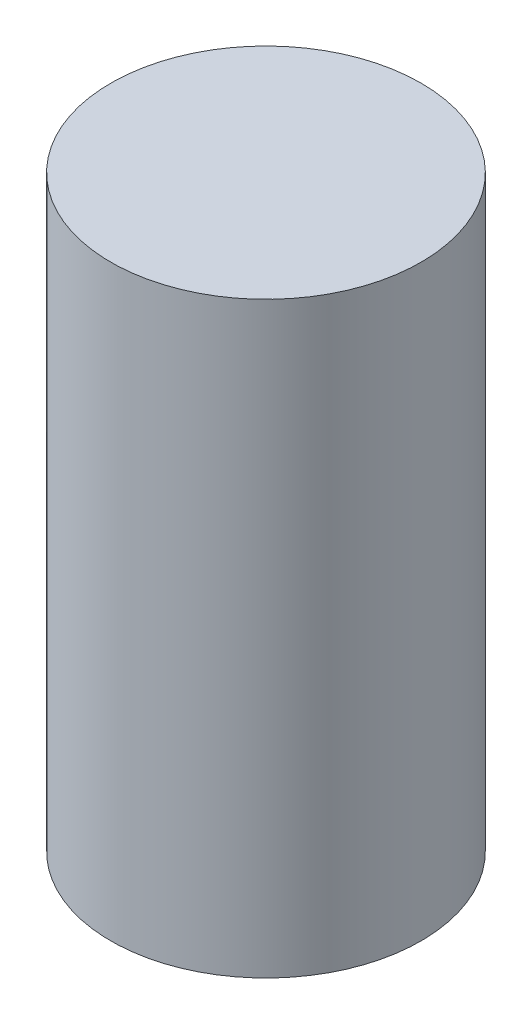
ISO-10303-21;
HEADER;
FILE_DESCRIPTION(('STEP AP214'),'2;1');
FILE_NAME('part.step','',(''),(''),'','','');
FILE_SCHEMA(('AUTOMOTIVE_DESIGN { 1 0 10303 214 1 1 1 1 }'));
ENDSEC;
DATA;
#1=APPLICATION_CONTEXT('core data for automotive mechanical design processes');
#2=APPLICATION_PROTOCOL_DEFINITION('international standard','automotive_design',2000,#1);
#3=PRODUCT_CONTEXT('',#1,'mechanical');
#4=PRODUCT('Part','Part','',(#3));
#5=PRODUCT_RELATED_PRODUCT_CATEGORY('part','',(#4));
#6=PRODUCT_DEFINITION_FORMATION('','',#4);
#7=PRODUCT_DEFINITION_CONTEXT('part definition',#1,'design');
#8=PRODUCT_DEFINITION('design','',#6,#7);
#9=PRODUCT_DEFINITION_SHAPE('','',#8);
#10=(LENGTH_UNIT() NAMED_UNIT(*) SI_UNIT(.MILLI.,.METRE.));
#11=(NAMED_UNIT(*) PLANE_ANGLE_UNIT() SI_UNIT($,.RADIAN.));
#12=(NAMED_UNIT(*) SI_UNIT($,.STERADIAN.) SOLID_ANGLE_UNIT());
#13=UNCERTAINTY_MEASURE_WITH_UNIT(LENGTH_MEASURE(1.E-05),#10,'distance_accuracy_value','');
#14=(GEOMETRIC_REPRESENTATION_CONTEXT(3) GLOBAL_UNCERTAINTY_ASSIGNED_CONTEXT((#13)) GLOBAL_UNIT_ASSIGNED_CONTEXT((#10,
#11,#12)) REPRESENTATION_CONTEXT('',''));
#15=CARTESIAN_POINT('',(0.,0.,0.));
#16=DIRECTION('',(0.,0.,1.));
#17=DIRECTION('',(1.,0.,0.));
#18=AXIS2_PLACEMENT_3D('',#15,#16,#17);
#19=CARTESIAN_POINT('',(0.,24.638,0.));
#20=DIRECTION('',(0.,-1.,0.));
#21=DIRECTION('',(0.,0.,-1.));
#22=AXIS2_PLACEMENT_3D('',#19,#20,#21);
#23=CYLINDRICAL_SURFACE('',#22,6.5024);
#24=CARTESIAN_POINT('',(0.,24.638,0.));
#25=DIRECTION('',(0.,1.,0.));
#26=DIRECTION('',(0.,0.,1.));
#27=AXIS2_PLACEMENT_3D('',#24,#25,#26);
#28=CIRCLE('',#27,6.5024);
#29=CARTESIAN_POINT('',(0.,24.638,-6.5024));
#30=VERTEX_POINT('',#29);
#31=EDGE_CURVE('E10',#30,#30,#28,.T.);
#32=CARTESIAN_POINT('',(0.,0.,0.));
#33=DIRECTION('',(0.,1.,0.));
#34=DIRECTION('',(0.,0.,1.));
#35=AXIS2_PLACEMENT_3D('',#32,#33,#34);
#36=CIRCLE('',#35,6.5024);
#37=CARTESIAN_POINT('',(0.,0.,-6.5024));
#38=VERTEX_POINT('',#37);
#39=EDGE_CURVE('E34',#38,#38,#36,.T.);
#40=CARTESIAN_POINT('',(0.,24.638,-6.5024));
#41=CARTESIAN_POINT('',(0.,24.3813541666667,-6.5024));
#42=CARTESIAN_POINT('',(0.,24.1247083333333,-6.5024));
#43=CARTESIAN_POINT('',(0.,23.6114166666667,-6.5024));
#44=CARTESIAN_POINT('',(0.,23.3547708333333,-6.5024));
#45=CARTESIAN_POINT('',(0.,22.8414791666667,-6.5024));
#46=CARTESIAN_POINT('',(0.,22.5848333333333,-6.5024));
#47=CARTESIAN_POINT('',(0.,22.0715416666667,-6.5024));
#48=CARTESIAN_POINT('',(0.,21.8148958333333,-6.5024));
#49=CARTESIAN_POINT('',(0.,21.3016041666667,-6.5024));
#50=CARTESIAN_POINT('',(0.,21.0449583333333,-6.5024));
#51=CARTESIAN_POINT('',(0.,20.5316666666667,-6.5024));
#52=CARTESIAN_POINT('',(0.,20.2750208333333,-6.5024));
#53=CARTESIAN_POINT('',(0.,19.7617291666667,-6.5024));
#54=CARTESIAN_POINT('',(0.,19.5050833333333,-6.5024));
#55=CARTESIAN_POINT('',(0.,18.9917916666667,-6.5024));
#56=CARTESIAN_POINT('',(0.,18.7351458333333,-6.5024));
#57=CARTESIAN_POINT('',(0.,18.2218541666667,-6.5024));
#58=CARTESIAN_POINT('',(0.,17.9652083333333,-6.5024));
#59=CARTESIAN_POINT('',(0.,17.4519166666667,-6.5024));
#60=CARTESIAN_POINT('',(0.,17.1952708333333,-6.5024));
#61=CARTESIAN_POINT('',(0.,16.6819791666667,-6.5024));
#62=CARTESIAN_POINT('',(0.,16.4253333333333,-6.5024));
#63=CARTESIAN_POINT('',(0.,15.9120416666667,-6.5024));
#64=CARTESIAN_POINT('',(0.,15.6553958333333,-6.5024));
#65=CARTESIAN_POINT('',(0.,15.1421041666667,-6.5024));
#66=CARTESIAN_POINT('',(0.,14.8854583333333,-6.5024));
#67=CARTESIAN_POINT('',(0.,14.3721666666667,-6.5024));
#68=CARTESIAN_POINT('',(0.,14.1155208333333,-6.5024));
#69=CARTESIAN_POINT('',(0.,13.6022291666667,-6.5024));
#70=CARTESIAN_POINT('',(0.,13.3455833333333,-6.5024));
#71=CARTESIAN_POINT('',(0.,12.8322916666667,-6.5024));
#72=CARTESIAN_POINT('',(0.,12.5756458333333,-6.5024));
#73=CARTESIAN_POINT('',(0.,12.0623541666667,-6.5024));
#74=CARTESIAN_POINT('',(0.,11.8057083333333,-6.5024));
#75=CARTESIAN_POINT('',(0.,11.2924166666667,-6.5024));
#76=CARTESIAN_POINT('',(0.,11.0357708333333,-6.5024));
#77=CARTESIAN_POINT('',(0.,10.5224791666667,-6.5024));
#78=CARTESIAN_POINT('',(0.,10.2658333333333,-6.5024));
#79=CARTESIAN_POINT('',(0.,9.75254166666666,-6.5024));
#80=CARTESIAN_POINT('',(0.,9.49589583333333,-6.5024));
#81=CARTESIAN_POINT('',(0.,8.98260416666666,-6.5024));
#82=CARTESIAN_POINT('',(0.,8.72595833333333,-6.5024));
#83=CARTESIAN_POINT('',(0.,8.21266666666667,-6.5024));
#84=CARTESIAN_POINT('',(0.,7.95602083333333,-6.5024));
#85=CARTESIAN_POINT('',(0.,7.44272916666666,-6.5024));
#86=CARTESIAN_POINT('',(0.,7.18608333333333,-6.5024));
#87=CARTESIAN_POINT('',(0.,6.67279166666666,-6.5024));
#88=CARTESIAN_POINT('',(0.,6.41614583333333,-6.5024));
#89=CARTESIAN_POINT('',(0.,5.90285416666666,-6.5024));
#90=CARTESIAN_POINT('',(0.,5.64620833333333,-6.5024));
#91=CARTESIAN_POINT('',(0.,5.13291666666666,-6.5024));
#92=CARTESIAN_POINT('',(0.,4.87627083333333,-6.5024));
#93=CARTESIAN_POINT('',(0.,4.36297916666667,-6.5024));
#94=CARTESIAN_POINT('',(0.,4.10633333333333,-6.5024));
#95=CARTESIAN_POINT('',(0.,3.59304166666666,-6.5024));
#96=CARTESIAN_POINT('',(0.,3.33639583333333,-6.5024));
#97=CARTESIAN_POINT('',(0.,2.82310416666666,-6.5024));
#98=CARTESIAN_POINT('',(0.,2.56645833333333,-6.5024));
#99=CARTESIAN_POINT('',(0.,2.05316666666666,-6.5024));
#100=CARTESIAN_POINT('',(0.,1.79652083333333,-6.5024));
#101=CARTESIAN_POINT('',(0.,1.28322916666666,-6.5024));
#102=CARTESIAN_POINT('',(0.,1.02658333333333,-6.5024));
#103=CARTESIAN_POINT('',(0.,0.513291666666664,-6.5024));
#104=CARTESIAN_POINT('',(0.,0.25664583333333,-6.5024));
#105=CARTESIAN_POINT('',(0.,0.,-6.5024));
#106=B_SPLINE_CURVE_WITH_KNOTS('',3,(#40,#41,#42,#43,#44,#45,#46,#47,#48,#49,#50,#51,#52,#53,
#54,#55,#56,#57,#58,#59,#60,#61,#62,#63,#64,#65,#66,#67,#68,#69,#70,#71,#72,#73,#74,#75,#76,#77,
#78,#79,#80,#81,#82,#83,#84,#85,#86,#87,#88,#89,#90,#91,#92,#93,#94,#95,#96,#97,#98,#99,#100,
#101,#102,#103,#104,#105),.UNSPECIFIED.,.F.,.F.,(4,2,2,2,2,2,2,2,2,2,2,2,2,2,2,2,2,2,2,2,2,2,2,
2,2,2,2,2,2,2,2,2,4),(0.,0.769937499999998,1.539875,2.3098125,3.07975,3.8496875,4.619625,
5.3895625,6.1595,6.9294375,7.699375,8.4693125,9.23925,10.0091875,10.779125,11.5490625,12.319,
13.0889375,13.858875,14.6288125,15.39875,16.1686875,16.938625,17.7085625,18.4785,19.2484375,
20.018375,20.7883125,21.55825,22.3281875,23.098125,23.8680625,24.638),.UNSPECIFIED.);
#107=EDGE_CURVE('BSEAM31',#30,#38,#106,.T.);
#108=ORIENTED_EDGE('',*,*,#31,.F.);
#109=ORIENTED_EDGE('',*,*,#39,.T.);
#110=ORIENTED_EDGE('',*,*,#107,.T.);
#111=ORIENTED_EDGE('',*,*,#107,.F.);
#112=EDGE_LOOP('',(#108,#110,#109,#111));
#113=FACE_BOUND('',#112,.T.);
#114=ADVANCED_FACE('F31',(#113),#23,.T.);
#115=CARTESIAN_POINT('',(0.,24.638,0.));
#116=DIRECTION('',(0.,1.,0.));
#117=DIRECTION('',(0.,0.,1.));
#118=AXIS2_PLACEMENT_3D('',#115,#116,#117);
#119=PLANE('',#118);
#120=ORIENTED_EDGE('',*,*,#31,.T.);
#121=EDGE_LOOP('',(#120));
#122=FACE_BOUND('',#121,.T.);
#123=ADVANCED_FACE('F46',(#122),#119,.T.);
#124=CARTESIAN_POINT('',(0.,0.,0.));
#125=DIRECTION('',(0.,1.,0.));
#126=DIRECTION('',(0.,0.,1.));
#127=AXIS2_PLACEMENT_3D('',#124,#125,#126);
#128=PLANE('',#127);
#129=ORIENTED_EDGE('',*,*,#39,.F.);
#130=EDGE_LOOP('',(#129));
#131=FACE_BOUND('',#130,.T.);
#132=ADVANCED_FACE('F44',(#131),#128,.F.);
#133=CLOSED_SHELL('',(#114,#123,#132));
#134=MANIFOLD_SOLID_BREP('B2',#133);
#135=ADVANCED_BREP_SHAPE_REPRESENTATION('',(#18,#134),#14);
#136=SHAPE_DEFINITION_REPRESENTATION(#9,#135);
ENDSEC;
END-ISO-10303-21;
